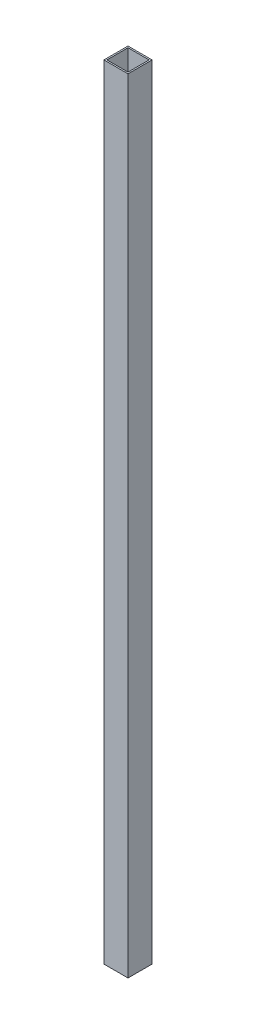
ISO-10303-21;
HEADER;
FILE_DESCRIPTION(('STEP AP214'),'2;1');
FILE_NAME('part.step','',(''),(''),'','','');
FILE_SCHEMA(('AUTOMOTIVE_DESIGN { 1 0 10303 214 1 1 1 1 }'));
ENDSEC;
DATA;
#1=APPLICATION_CONTEXT('core data for automotive mechanical design processes');
#2=APPLICATION_PROTOCOL_DEFINITION('international standard','automotive_design',2000,#1);
#3=PRODUCT_CONTEXT('',#1,'mechanical');
#4=PRODUCT('Part','Part','',(#3));
#5=PRODUCT_RELATED_PRODUCT_CATEGORY('part','',(#4));
#6=PRODUCT_DEFINITION_FORMATION('','',#4);
#7=PRODUCT_DEFINITION_CONTEXT('part definition',#1,'design');
#8=PRODUCT_DEFINITION('design','',#6,#7);
#9=PRODUCT_DEFINITION_SHAPE('','',#8);
#10=(LENGTH_UNIT() NAMED_UNIT(*) SI_UNIT(.MILLI.,.METRE.));
#11=(NAMED_UNIT(*) PLANE_ANGLE_UNIT() SI_UNIT($,.RADIAN.));
#12=(NAMED_UNIT(*) SI_UNIT($,.STERADIAN.) SOLID_ANGLE_UNIT());
#13=UNCERTAINTY_MEASURE_WITH_UNIT(LENGTH_MEASURE(1.E-05),#10,'distance_accuracy_value','');
#14=(GEOMETRIC_REPRESENTATION_CONTEXT(3) GLOBAL_UNCERTAINTY_ASSIGNED_CONTEXT((#13)) GLOBAL_UNIT_ASSIGNED_CONTEXT((#10,
#11,#12)) REPRESENTATION_CONTEXT('',''));
#15=CARTESIAN_POINT('',(0.,0.,0.));
#16=DIRECTION('',(0.,0.,1.));
#17=DIRECTION('',(1.,0.,0.));
#18=AXIS2_PLACEMENT_3D('',#15,#16,#17);
#19=CARTESIAN_POINT('',(0.,825.5,0.));
#20=DIRECTION('',(0.,-1.,0.));
#21=DIRECTION('',(0.,0.,-1.));
#22=AXIS2_PLACEMENT_3D('',#19,#20,#21);
#23=PLANE('',#22);
#24=DIRECTION('',(0.,0.,1.));
#25=VECTOR('',#24,1.);
#26=CARTESIAN_POINT('',(-12.7,825.5,-12.7));
#27=LINE('',#26,#25);
#28=CARTESIAN_POINT('',(-12.7,825.5,-12.7));
#29=VERTEX_POINT('',#28);
#30=CARTESIAN_POINT('',(-12.7,825.5,12.7));
#31=VERTEX_POINT('',#30);
#32=EDGE_CURVE('E134',#29,#31,#27,.T.);
#33=ORIENTED_EDGE('',*,*,#32,.T.);
#34=DIRECTION('',(1.,0.,0.));
#35=VECTOR('',#34,1.);
#36=CARTESIAN_POINT('',(12.7,825.5,12.7));
#37=LINE('',#36,#35);
#38=CARTESIAN_POINT('',(12.7,825.5,12.7));
#39=VERTEX_POINT('',#38);
#40=EDGE_CURVE('E137',#31,#39,#37,.T.);
#41=ORIENTED_EDGE('',*,*,#40,.T.);
#42=DIRECTION('',(0.,0.,-1.));
#43=VECTOR('',#42,1.);
#44=CARTESIAN_POINT('',(12.7,825.5,-12.7));
#45=LINE('',#44,#43);
#46=CARTESIAN_POINT('',(12.7,825.5,-12.7));
#47=VERTEX_POINT('',#46);
#48=EDGE_CURVE('E140',#39,#47,#45,.T.);
#49=ORIENTED_EDGE('',*,*,#48,.T.);
#50=DIRECTION('',(-1.,0.,0.));
#51=VECTOR('',#50,1.);
#52=CARTESIAN_POINT('',(12.7,825.5,-12.7));
#53=LINE('',#52,#51);
#54=EDGE_CURVE('E142',#47,#29,#53,.T.);
#55=ORIENTED_EDGE('',*,*,#54,.T.);
#56=EDGE_LOOP('',(#33,#41,#49,#55));
#57=FACE_BOUND('',#56,.T.);
#58=DIRECTION('',(0.,0.,1.));
#59=VECTOR('',#58,1.);
#60=CARTESIAN_POINT('',(-11.1125,825.5,-11.1125));
#61=LINE('',#60,#59);
#62=CARTESIAN_POINT('',(-11.1125,825.5,-11.1125));
#63=VERTEX_POINT('',#62);
#64=CARTESIAN_POINT('',(-11.1125,825.5,11.1125));
#65=VERTEX_POINT('',#64);
#66=EDGE_CURVE('E98',#63,#65,#61,.T.);
#67=ORIENTED_EDGE('',*,*,#66,.F.);
#68=DIRECTION('',(-1.,0.,0.));
#69=VECTOR('',#68,1.);
#70=CARTESIAN_POINT('',(11.1125,825.5,-11.1125));
#71=LINE('',#70,#69);
#72=CARTESIAN_POINT('',(11.1125,825.5,-11.1125));
#73=VERTEX_POINT('',#72);
#74=EDGE_CURVE('E120',#73,#63,#71,.T.);
#75=ORIENTED_EDGE('',*,*,#74,.F.);
#76=DIRECTION('',(0.,0.,-1.));
#77=VECTOR('',#76,1.);
#78=CARTESIAN_POINT('',(11.1125,825.5,-11.1125));
#79=LINE('',#78,#77);
#80=CARTESIAN_POINT('',(11.1125,825.5,11.1125));
#81=VERTEX_POINT('',#80);
#82=EDGE_CURVE('E118',#81,#73,#79,.T.);
#83=ORIENTED_EDGE('',*,*,#82,.F.);
#84=DIRECTION('',(1.,0.,0.));
#85=VECTOR('',#84,1.);
#86=CARTESIAN_POINT('',(11.1125,825.5,11.1125));
#87=LINE('',#86,#85);
#88=EDGE_CURVE('E106',#65,#81,#87,.T.);
#89=ORIENTED_EDGE('',*,*,#88,.F.);
#90=EDGE_LOOP('',(#67,#75,#83,#89));
#91=FACE_BOUND('',#90,.T.);
#92=ADVANCED_FACE('F33',(#57,#91),#23,.F.);
#93=CARTESIAN_POINT('',(0.,0.,0.));
#94=DIRECTION('',(0.,-1.,0.));
#95=DIRECTION('',(0.,0.,-1.));
#96=AXIS2_PLACEMENT_3D('',#93,#94,#95);
#97=PLANE('',#96);
#98=DIRECTION('',(0.,0.,1.));
#99=VECTOR('',#98,1.);
#100=CARTESIAN_POINT('',(-12.7,0.,-12.7));
#101=LINE('',#100,#99);
#102=CARTESIAN_POINT('',(-12.7,0.,-12.7));
#103=VERTEX_POINT('',#102);
#104=CARTESIAN_POINT('',(-12.7,0.,12.7));
#105=VERTEX_POINT('',#104);
#106=EDGE_CURVE('E114',#103,#105,#101,.T.);
#107=ORIENTED_EDGE('',*,*,#106,.F.);
#108=DIRECTION('',(-1.,0.,0.));
#109=VECTOR('',#108,1.);
#110=CARTESIAN_POINT('',(12.7,0.,-12.7));
#111=LINE('',#110,#109);
#112=CARTESIAN_POINT('',(12.7,0.,-12.7));
#113=VERTEX_POINT('',#112);
#114=EDGE_CURVE('E138',#113,#103,#111,.T.);
#115=ORIENTED_EDGE('',*,*,#114,.F.);
#116=DIRECTION('',(0.,0.,-1.));
#117=VECTOR('',#116,1.);
#118=CARTESIAN_POINT('',(12.7,0.,-12.7));
#119=LINE('',#118,#117);
#120=CARTESIAN_POINT('',(12.7,0.,12.7));
#121=VERTEX_POINT('',#120);
#122=EDGE_CURVE('E149',#121,#113,#119,.T.);
#123=ORIENTED_EDGE('',*,*,#122,.F.);
#124=DIRECTION('',(1.,0.,0.));
#125=VECTOR('',#124,1.);
#126=CARTESIAN_POINT('',(12.7,0.,12.7));
#127=LINE('',#126,#125);
#128=EDGE_CURVE('E147',#105,#121,#127,.T.);
#129=ORIENTED_EDGE('',*,*,#128,.F.);
#130=EDGE_LOOP('',(#107,#115,#123,#129));
#131=FACE_BOUND('',#130,.T.);
#132=DIRECTION('',(-1.,0.,0.));
#133=VECTOR('',#132,1.);
#134=CARTESIAN_POINT('',(11.1125,0.,-11.1125));
#135=LINE('',#134,#133);
#136=CARTESIAN_POINT('',(11.1125,0.,-11.1125));
#137=VERTEX_POINT('',#136);
#138=CARTESIAN_POINT('',(-11.1125,0.,-11.1125));
#139=VERTEX_POINT('',#138);
#140=EDGE_CURVE('E107',#137,#139,#135,.T.);
#141=ORIENTED_EDGE('',*,*,#140,.T.);
#142=DIRECTION('',(0.,0.,1.));
#143=VECTOR('',#142,1.);
#144=CARTESIAN_POINT('',(-11.1125,0.,-11.1125));
#145=LINE('',#144,#143);
#146=CARTESIAN_POINT('',(-11.1125,0.,11.1125));
#147=VERTEX_POINT('',#146);
#148=EDGE_CURVE('E56',#139,#147,#145,.T.);
#149=ORIENTED_EDGE('',*,*,#148,.T.);
#150=DIRECTION('',(1.,0.,0.));
#151=VECTOR('',#150,1.);
#152=CARTESIAN_POINT('',(11.1125,0.,11.1125));
#153=LINE('',#152,#151);
#154=CARTESIAN_POINT('',(11.1125,0.,11.1125));
#155=VERTEX_POINT('',#154);
#156=EDGE_CURVE('E113',#147,#155,#153,.T.);
#157=ORIENTED_EDGE('',*,*,#156,.T.);
#158=DIRECTION('',(0.,0.,-1.));
#159=VECTOR('',#158,1.);
#160=CARTESIAN_POINT('',(11.1125,0.,-11.1125));
#161=LINE('',#160,#159);
#162=EDGE_CURVE('E126',#155,#137,#161,.T.);
#163=ORIENTED_EDGE('',*,*,#162,.T.);
#164=EDGE_LOOP('',(#141,#149,#157,#163));
#165=FACE_BOUND('',#164,.T.);
#166=ADVANCED_FACE('F167',(#131,#165),#97,.T.);
#167=CARTESIAN_POINT('',(-12.7,825.5,-12.7));
#168=DIRECTION('',(1.,0.,0.));
#169=DIRECTION('',(0.,0.,-1.));
#170=AXIS2_PLACEMENT_3D('',#167,#168,#169);
#171=PLANE('',#170);
#172=ORIENTED_EDGE('',*,*,#106,.T.);
#173=DIRECTION('',(0.,-1.,0.));
#174=VECTOR('',#173,1.);
#175=CARTESIAN_POINT('',(-12.7,825.5,12.7));
#176=LINE('',#175,#174);
#177=EDGE_CURVE('E11',#31,#105,#176,.T.);
#178=ORIENTED_EDGE('',*,*,#177,.F.);
#179=ORIENTED_EDGE('',*,*,#32,.F.);
#180=DIRECTION('',(0.,-1.,0.));
#181=VECTOR('',#180,1.);
#182=CARTESIAN_POINT('',(-12.7,825.5,-12.7));
#183=LINE('',#182,#181);
#184=EDGE_CURVE('E144',#29,#103,#183,.T.);
#185=ORIENTED_EDGE('',*,*,#184,.T.);
#186=EDGE_LOOP('',(#172,#178,#179,#185));
#187=FACE_BOUND('',#186,.T.);
#188=ADVANCED_FACE('F35',(#187),#171,.F.);
#189=CARTESIAN_POINT('',(12.7,825.5,12.7));
#190=DIRECTION('',(0.,0.,-1.));
#191=DIRECTION('',(-1.,0.,0.));
#192=AXIS2_PLACEMENT_3D('',#189,#190,#191);
#193=PLANE('',#192);
#194=ORIENTED_EDGE('',*,*,#128,.T.);
#195=DIRECTION('',(0.,-1.,0.));
#196=VECTOR('',#195,1.);
#197=CARTESIAN_POINT('',(12.7,825.5,12.7));
#198=LINE('',#197,#196);
#199=EDGE_CURVE('E41',#39,#121,#198,.T.);
#200=ORIENTED_EDGE('',*,*,#199,.F.);
#201=ORIENTED_EDGE('',*,*,#40,.F.);
#202=ORIENTED_EDGE('',*,*,#177,.T.);
#203=EDGE_LOOP('',(#194,#200,#201,#202));
#204=FACE_BOUND('',#203,.T.);
#205=ADVANCED_FACE('F177',(#204),#193,.F.);
#206=CARTESIAN_POINT('',(12.7,825.5,-12.7));
#207=DIRECTION('',(-1.,0.,0.));
#208=DIRECTION('',(0.,0.,1.));
#209=AXIS2_PLACEMENT_3D('',#206,#207,#208);
#210=PLANE('',#209);
#211=ORIENTED_EDGE('',*,*,#122,.T.);
#212=DIRECTION('',(0.,-1.,0.));
#213=VECTOR('',#212,1.);
#214=CARTESIAN_POINT('',(12.7,825.5,-12.7));
#215=LINE('',#214,#213);
#216=EDGE_CURVE('E154',#47,#113,#215,.T.);
#217=ORIENTED_EDGE('',*,*,#216,.F.);
#218=ORIENTED_EDGE('',*,*,#48,.F.);
#219=ORIENTED_EDGE('',*,*,#199,.T.);
#220=EDGE_LOOP('',(#211,#217,#218,#219));
#221=FACE_BOUND('',#220,.T.);
#222=ADVANCED_FACE('F161',(#221),#210,.F.);
#223=CARTESIAN_POINT('',(12.7,825.5,-12.7));
#224=DIRECTION('',(0.,0.,1.));
#225=DIRECTION('',(1.,0.,0.));
#226=AXIS2_PLACEMENT_3D('',#223,#224,#225);
#227=PLANE('',#226);
#228=ORIENTED_EDGE('',*,*,#114,.T.);
#229=ORIENTED_EDGE('',*,*,#184,.F.);
#230=ORIENTED_EDGE('',*,*,#54,.F.);
#231=ORIENTED_EDGE('',*,*,#216,.T.);
#232=EDGE_LOOP('',(#228,#229,#230,#231));
#233=FACE_BOUND('',#232,.T.);
#234=ADVANCED_FACE('F171',(#233),#227,.F.);
#235=CARTESIAN_POINT('',(-11.1125,825.5,-11.1125));
#236=DIRECTION('',(1.,0.,0.));
#237=DIRECTION('',(0.,0.,-1.));
#238=AXIS2_PLACEMENT_3D('',#235,#236,#237);
#239=PLANE('',#238);
#240=ORIENTED_EDGE('',*,*,#148,.F.);
#241=DIRECTION('',(0.,-1.,0.));
#242=VECTOR('',#241,1.);
#243=CARTESIAN_POINT('',(-11.1125,825.5,-11.1125));
#244=LINE('',#243,#242);
#245=EDGE_CURVE('E102',#63,#139,#244,.T.);
#246=ORIENTED_EDGE('',*,*,#245,.F.);
#247=ORIENTED_EDGE('',*,*,#66,.T.);
#248=DIRECTION('',(0.,-1.,0.));
#249=VECTOR('',#248,1.);
#250=CARTESIAN_POINT('',(-11.1125,825.5,11.1125));
#251=LINE('',#250,#249);
#252=EDGE_CURVE('E101',#65,#147,#251,.T.);
#253=ORIENTED_EDGE('',*,*,#252,.T.);
#254=EDGE_LOOP('',(#240,#246,#247,#253));
#255=FACE_BOUND('',#254,.T.);
#256=ADVANCED_FACE('F100',(#255),#239,.T.);
#257=CARTESIAN_POINT('',(11.1125,825.5,11.1125));
#258=DIRECTION('',(0.,0.,-1.));
#259=DIRECTION('',(-1.,0.,0.));
#260=AXIS2_PLACEMENT_3D('',#257,#258,#259);
#261=PLANE('',#260);
#262=ORIENTED_EDGE('',*,*,#156,.F.);
#263=ORIENTED_EDGE('',*,*,#252,.F.);
#264=ORIENTED_EDGE('',*,*,#88,.T.);
#265=DIRECTION('',(0.,-1.,0.));
#266=VECTOR('',#265,1.);
#267=CARTESIAN_POINT('',(11.1125,825.5,11.1125));
#268=LINE('',#267,#266);
#269=EDGE_CURVE('E115',#81,#155,#268,.T.);
#270=ORIENTED_EDGE('',*,*,#269,.T.);
#271=EDGE_LOOP('',(#262,#263,#264,#270));
#272=FACE_BOUND('',#271,.T.);
#273=ADVANCED_FACE('F110',(#272),#261,.T.);
#274=CARTESIAN_POINT('',(11.1125,825.5,-11.1125));
#275=DIRECTION('',(-1.,0.,0.));
#276=DIRECTION('',(0.,0.,1.));
#277=AXIS2_PLACEMENT_3D('',#274,#275,#276);
#278=PLANE('',#277);
#279=ORIENTED_EDGE('',*,*,#162,.F.);
#280=ORIENTED_EDGE('',*,*,#269,.F.);
#281=ORIENTED_EDGE('',*,*,#82,.T.);
#282=DIRECTION('',(0.,-1.,0.));
#283=VECTOR('',#282,1.);
#284=CARTESIAN_POINT('',(11.1125,825.5,-11.1125));
#285=LINE('',#284,#283);
#286=EDGE_CURVE('E48',#73,#137,#285,.T.);
#287=ORIENTED_EDGE('',*,*,#286,.T.);
#288=EDGE_LOOP('',(#279,#280,#281,#287));
#289=FACE_BOUND('',#288,.T.);
#290=ADVANCED_FACE('F200',(#289),#278,.T.);
#291=CARTESIAN_POINT('',(11.1125,825.5,-11.1125));
#292=DIRECTION('',(0.,0.,1.));
#293=DIRECTION('',(1.,0.,0.));
#294=AXIS2_PLACEMENT_3D('',#291,#292,#293);
#295=PLANE('',#294);
#296=ORIENTED_EDGE('',*,*,#140,.F.);
#297=ORIENTED_EDGE('',*,*,#286,.F.);
#298=ORIENTED_EDGE('',*,*,#74,.T.);
#299=ORIENTED_EDGE('',*,*,#245,.T.);
#300=EDGE_LOOP('',(#296,#297,#298,#299));
#301=FACE_BOUND('',#300,.T.);
#302=ADVANCED_FACE('F204',(#301),#295,.T.);
#303=CLOSED_SHELL('',(#92,#166,#188,#205,#222,#234,#256,#273,#290,#302));
#304=MANIFOLD_SOLID_BREP('B2',#303);
#305=ADVANCED_BREP_SHAPE_REPRESENTATION('',(#18,#304),#14);
#306=SHAPE_DEFINITION_REPRESENTATION(#9,#305);
ENDSEC;
END-ISO-10303-21;
